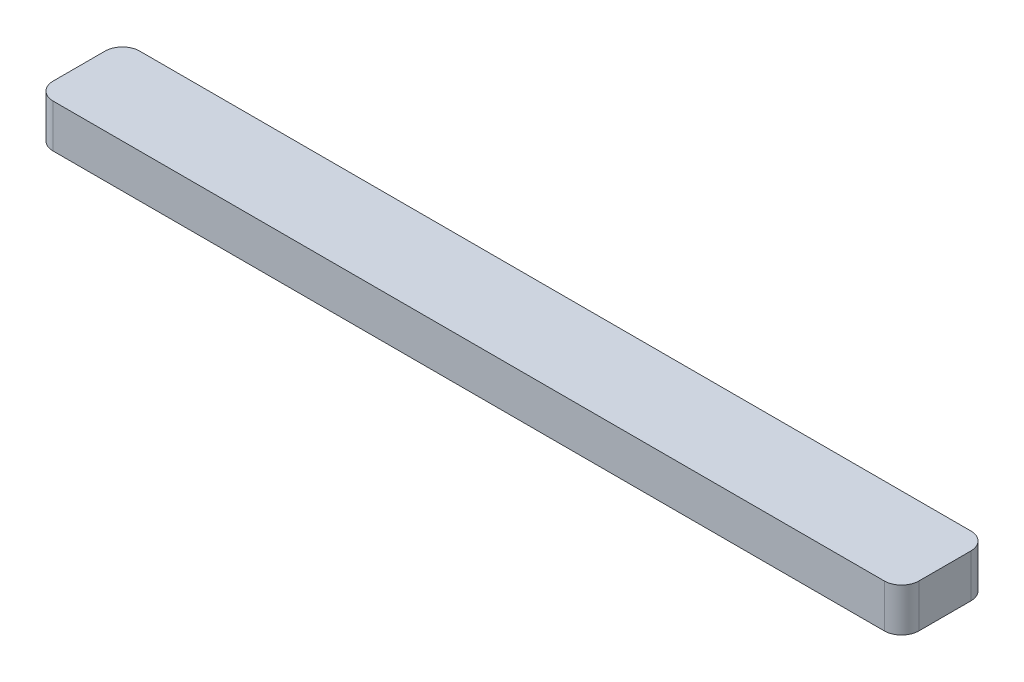
ISO-10303-21;
HEADER;
FILE_DESCRIPTION(('STEP AP214'),'2;1');
FILE_NAME('part.step','',(''),(''),'','','');
FILE_SCHEMA(('AUTOMOTIVE_DESIGN { 1 0 10303 214 1 1 1 1 }'));
ENDSEC;
DATA;
#1=APPLICATION_CONTEXT('core data for automotive mechanical design processes');
#2=APPLICATION_PROTOCOL_DEFINITION('international standard','automotive_design',2000,#1);
#3=PRODUCT_CONTEXT('',#1,'mechanical');
#4=PRODUCT('Part','Part','',(#3));
#5=PRODUCT_RELATED_PRODUCT_CATEGORY('part','',(#4));
#6=PRODUCT_DEFINITION_FORMATION('','',#4);
#7=PRODUCT_DEFINITION_CONTEXT('part definition',#1,'design');
#8=PRODUCT_DEFINITION('design','',#6,#7);
#9=PRODUCT_DEFINITION_SHAPE('','',#8);
#10=(LENGTH_UNIT() NAMED_UNIT(*) SI_UNIT(.MILLI.,.METRE.));
#11=(NAMED_UNIT(*) PLANE_ANGLE_UNIT() SI_UNIT($,.RADIAN.));
#12=(NAMED_UNIT(*) SI_UNIT($,.STERADIAN.) SOLID_ANGLE_UNIT());
#13=UNCERTAINTY_MEASURE_WITH_UNIT(LENGTH_MEASURE(1.E-05),#10,'distance_accuracy_value','');
#14=(GEOMETRIC_REPRESENTATION_CONTEXT(3) GLOBAL_UNCERTAINTY_ASSIGNED_CONTEXT((#13)) GLOBAL_UNIT_ASSIGNED_CONTEXT((#10,
#11,#12)) REPRESENTATION_CONTEXT('',''));
#15=CARTESIAN_POINT('',(0.,0.,0.));
#16=DIRECTION('',(0.,0.,1.));
#17=DIRECTION('',(1.,0.,0.));
#18=AXIS2_PLACEMENT_3D('',#15,#16,#17);
#19=CARTESIAN_POINT('',(48.,5.,-3.));
#20=DIRECTION('',(0.,-1.,0.));
#21=DIRECTION('',(0.,0.,-1.));
#22=AXIS2_PLACEMENT_3D('',#19,#20,#21);
#23=CYLINDRICAL_SURFACE('',#22,2.);
#24=CARTESIAN_POINT('',(48.,0.,-3.));
#25=DIRECTION('',(0.,1.,0.));
#26=DIRECTION('',(0.,0.,1.));
#27=AXIS2_PLACEMENT_3D('',#24,#25,#26);
#28=CIRCLE('',#27,2.);
#29=CARTESIAN_POINT('',(50.,0.,-3.));
#30=VERTEX_POINT('',#29);
#31=CARTESIAN_POINT('',(48.,0.,-5.));
#32=VERTEX_POINT('',#31);
#33=EDGE_CURVE('E129',#30,#32,#28,.T.);
#34=ORIENTED_EDGE('',*,*,#33,.T.);
#35=DIRECTION('',(0.,-1.,0.));
#36=VECTOR('',#35,1.);
#37=CARTESIAN_POINT('',(48.,5.,-5.));
#38=LINE('',#37,#36);
#39=CARTESIAN_POINT('',(48.,5.,-5.));
#40=VERTEX_POINT('',#39);
#41=EDGE_CURVE('E11',#40,#32,#38,.T.);
#42=ORIENTED_EDGE('',*,*,#41,.F.);
#43=CARTESIAN_POINT('',(48.,5.,-3.));
#44=DIRECTION('',(0.,1.,0.));
#45=DIRECTION('',(0.,0.,1.));
#46=AXIS2_PLACEMENT_3D('',#43,#44,#45);
#47=CIRCLE('',#46,2.);
#48=CARTESIAN_POINT('',(50.,5.,-3.));
#49=VERTEX_POINT('',#48);
#50=EDGE_CURVE('E143',#49,#40,#47,.T.);
#51=ORIENTED_EDGE('',*,*,#50,.F.);
#52=DIRECTION('',(0.,-1.,0.));
#53=VECTOR('',#52,1.);
#54=CARTESIAN_POINT('',(50.,5.,-3.));
#55=LINE('',#54,#53);
#56=EDGE_CURVE('E125',#49,#30,#55,.T.);
#57=ORIENTED_EDGE('',*,*,#56,.T.);
#58=EDGE_LOOP('',(#34,#42,#51,#57));
#59=FACE_BOUND('',#58,.T.);
#60=ADVANCED_FACE('F33',(#59),#23,.T.);
#61=CARTESIAN_POINT('',(-48.,5.,-5.));
#62=DIRECTION('',(0.,0.,1.));
#63=DIRECTION('',(1.,0.,0.));
#64=AXIS2_PLACEMENT_3D('',#61,#62,#63);
#65=PLANE('',#64);
#66=DIRECTION('',(-1.,0.,0.));
#67=VECTOR('',#66,1.);
#68=CARTESIAN_POINT('',(-48.,0.,-5.));
#69=LINE('',#68,#67);
#70=CARTESIAN_POINT('',(-48.,0.,-5.));
#71=VERTEX_POINT('',#70);
#72=EDGE_CURVE('E132',#32,#71,#69,.T.);
#73=ORIENTED_EDGE('',*,*,#72,.T.);
#74=DIRECTION('',(0.,-1.,0.));
#75=VECTOR('',#74,1.);
#76=CARTESIAN_POINT('',(-48.,5.,-5.));
#77=LINE('',#76,#75);
#78=CARTESIAN_POINT('',(-48.,5.,-5.));
#79=VERTEX_POINT('',#78);
#80=EDGE_CURVE('E41',#79,#71,#77,.T.);
#81=ORIENTED_EDGE('',*,*,#80,.F.);
#82=DIRECTION('',(-1.,0.,0.));
#83=VECTOR('',#82,1.);
#84=CARTESIAN_POINT('',(-48.,5.,-5.));
#85=LINE('',#84,#83);
#86=EDGE_CURVE('E92',#40,#79,#85,.T.);
#87=ORIENTED_EDGE('',*,*,#86,.F.);
#88=ORIENTED_EDGE('',*,*,#41,.T.);
#89=EDGE_LOOP('',(#73,#81,#87,#88));
#90=FACE_BOUND('',#89,.T.);
#91=ADVANCED_FACE('F178',(#90),#65,.F.);
#92=CARTESIAN_POINT('',(-48.,5.,-3.));
#93=DIRECTION('',(0.,-1.,0.));
#94=DIRECTION('',(0.,0.,-1.));
#95=AXIS2_PLACEMENT_3D('',#92,#93,#94);
#96=CYLINDRICAL_SURFACE('',#95,2.);
#97=CARTESIAN_POINT('',(-48.,0.,-3.));
#98=DIRECTION('',(0.,1.,0.));
#99=DIRECTION('',(0.,0.,-1.));
#100=AXIS2_PLACEMENT_3D('',#97,#98,#99);
#101=CIRCLE('',#100,2.);
#102=CARTESIAN_POINT('',(-50.,0.,-3.));
#103=VERTEX_POINT('',#102);
#104=EDGE_CURVE('E134',#71,#103,#101,.T.);
#105=ORIENTED_EDGE('',*,*,#104,.T.);
#106=DIRECTION('',(0.,-1.,0.));
#107=VECTOR('',#106,1.);
#108=CARTESIAN_POINT('',(-50.,5.,-3.));
#109=LINE('',#108,#107);
#110=CARTESIAN_POINT('',(-50.,5.,-3.));
#111=VERTEX_POINT('',#110);
#112=EDGE_CURVE('E150',#111,#103,#109,.T.);
#113=ORIENTED_EDGE('',*,*,#112,.F.);
#114=CARTESIAN_POINT('',(-48.,5.,-3.));
#115=DIRECTION('',(0.,1.,0.));
#116=DIRECTION('',(0.,0.,-1.));
#117=AXIS2_PLACEMENT_3D('',#114,#115,#116);
#118=CIRCLE('',#117,2.);
#119=EDGE_CURVE('E158',#79,#111,#118,.T.);
#120=ORIENTED_EDGE('',*,*,#119,.F.);
#121=ORIENTED_EDGE('',*,*,#80,.T.);
#122=EDGE_LOOP('',(#105,#113,#120,#121));
#123=FACE_BOUND('',#122,.T.);
#124=ADVANCED_FACE('F156',(#123),#96,.T.);
#125=CARTESIAN_POINT('',(-50.,5.,-3.));
#126=DIRECTION('',(1.,0.,0.));
#127=DIRECTION('',(0.,0.,-1.));
#128=AXIS2_PLACEMENT_3D('',#125,#126,#127);
#129=PLANE('',#128);
#130=DIRECTION('',(0.,0.,1.));
#131=VECTOR('',#130,1.);
#132=CARTESIAN_POINT('',(-50.,0.,-3.));
#133=LINE('',#132,#131);
#134=CARTESIAN_POINT('',(-50.,0.,3.));
#135=VERTEX_POINT('',#134);
#136=EDGE_CURVE('E136',#103,#135,#133,.T.);
#137=ORIENTED_EDGE('',*,*,#136,.T.);
#138=DIRECTION('',(0.,-1.,0.));
#139=VECTOR('',#138,1.);
#140=CARTESIAN_POINT('',(-50.,5.,3.));
#141=LINE('',#140,#139);
#142=CARTESIAN_POINT('',(-50.,5.,3.));
#143=VERTEX_POINT('',#142);
#144=EDGE_CURVE('E147',#143,#135,#141,.T.);
#145=ORIENTED_EDGE('',*,*,#144,.F.);
#146=DIRECTION('',(0.,0.,1.));
#147=VECTOR('',#146,1.);
#148=CARTESIAN_POINT('',(-50.,5.,-3.));
#149=LINE('',#148,#147);
#150=EDGE_CURVE('E170',#111,#143,#149,.T.);
#151=ORIENTED_EDGE('',*,*,#150,.F.);
#152=ORIENTED_EDGE('',*,*,#112,.T.);
#153=EDGE_LOOP('',(#137,#145,#151,#152));
#154=FACE_BOUND('',#153,.T.);
#155=ADVANCED_FACE('F166',(#154),#129,.F.);
#156=CARTESIAN_POINT('',(-48.,5.,3.));
#157=DIRECTION('',(0.,-1.,0.));
#158=DIRECTION('',(0.,0.,-1.));
#159=AXIS2_PLACEMENT_3D('',#156,#157,#158);
#160=CYLINDRICAL_SURFACE('',#159,2.);
#161=CARTESIAN_POINT('',(-48.,0.,3.));
#162=DIRECTION('',(0.,1.,0.));
#163=DIRECTION('',(0.,0.,-1.));
#164=AXIS2_PLACEMENT_3D('',#161,#162,#163);
#165=CIRCLE('',#164,2.);
#166=CARTESIAN_POINT('',(-48.,0.,5.));
#167=VERTEX_POINT('',#166);
#168=EDGE_CURVE('E138',#135,#167,#165,.T.);
#169=ORIENTED_EDGE('',*,*,#168,.T.);
#170=DIRECTION('',(0.,-1.,0.));
#171=VECTOR('',#170,1.);
#172=CARTESIAN_POINT('',(-48.,5.,5.));
#173=LINE('',#172,#171);
#174=CARTESIAN_POINT('',(-48.,5.,5.));
#175=VERTEX_POINT('',#174);
#176=EDGE_CURVE('E120',#175,#167,#173,.T.);
#177=ORIENTED_EDGE('',*,*,#176,.F.);
#178=CARTESIAN_POINT('',(-48.,5.,3.));
#179=DIRECTION('',(0.,1.,0.));
#180=DIRECTION('',(0.,0.,-1.));
#181=AXIS2_PLACEMENT_3D('',#178,#179,#180);
#182=CIRCLE('',#181,2.);
#183=EDGE_CURVE('E111',#143,#175,#182,.T.);
#184=ORIENTED_EDGE('',*,*,#183,.F.);
#185=ORIENTED_EDGE('',*,*,#144,.T.);
#186=EDGE_LOOP('',(#169,#177,#184,#185));
#187=FACE_BOUND('',#186,.T.);
#188=ADVANCED_FACE('F169',(#187),#160,.T.);
#189=CARTESIAN_POINT('',(-48.,5.,5.));
#190=DIRECTION('',(0.,0.,-1.));
#191=DIRECTION('',(-1.,0.,0.));
#192=AXIS2_PLACEMENT_3D('',#189,#190,#191);
#193=PLANE('',#192);
#194=DIRECTION('',(1.,0.,0.));
#195=VECTOR('',#194,1.);
#196=CARTESIAN_POINT('',(-48.,0.,5.));
#197=LINE('',#196,#195);
#198=CARTESIAN_POINT('',(48.,0.,5.));
#199=VERTEX_POINT('',#198);
#200=EDGE_CURVE('E119',#167,#199,#197,.T.);
#201=ORIENTED_EDGE('',*,*,#200,.T.);
#202=DIRECTION('',(0.,-1.,0.));
#203=VECTOR('',#202,1.);
#204=CARTESIAN_POINT('',(48.,5.,5.));
#205=LINE('',#204,#203);
#206=CARTESIAN_POINT('',(48.,5.,5.));
#207=VERTEX_POINT('',#206);
#208=EDGE_CURVE('E116',#207,#199,#205,.T.);
#209=ORIENTED_EDGE('',*,*,#208,.F.);
#210=DIRECTION('',(1.,0.,0.));
#211=VECTOR('',#210,1.);
#212=CARTESIAN_POINT('',(-48.,5.,5.));
#213=LINE('',#212,#211);
#214=EDGE_CURVE('E105',#175,#207,#213,.T.);
#215=ORIENTED_EDGE('',*,*,#214,.F.);
#216=ORIENTED_EDGE('',*,*,#176,.T.);
#217=EDGE_LOOP('',(#201,#209,#215,#216));
#218=FACE_BOUND('',#217,.T.);
#219=ADVANCED_FACE('F117',(#218),#193,.F.);
#220=CARTESIAN_POINT('',(48.,5.,3.));
#221=DIRECTION('',(0.,-1.,0.));
#222=DIRECTION('',(0.,0.,-1.));
#223=AXIS2_PLACEMENT_3D('',#220,#221,#222);
#224=CYLINDRICAL_SURFACE('',#223,2.);
#225=CARTESIAN_POINT('',(48.,0.,3.));
#226=DIRECTION('',(0.,1.,0.));
#227=DIRECTION('',(0.,0.,-1.));
#228=AXIS2_PLACEMENT_3D('',#225,#226,#227);
#229=CIRCLE('',#228,2.);
#230=CARTESIAN_POINT('',(50.,0.,3.));
#231=VERTEX_POINT('',#230);
#232=EDGE_CURVE('E78',#199,#231,#229,.T.);
#233=ORIENTED_EDGE('',*,*,#232,.T.);
#234=DIRECTION('',(0.,-1.,0.));
#235=VECTOR('',#234,1.);
#236=CARTESIAN_POINT('',(50.,5.,3.));
#237=LINE('',#236,#235);
#238=CARTESIAN_POINT('',(50.,5.,3.));
#239=VERTEX_POINT('',#238);
#240=EDGE_CURVE('E121',#239,#231,#237,.T.);
#241=ORIENTED_EDGE('',*,*,#240,.F.);
#242=CARTESIAN_POINT('',(48.,5.,3.));
#243=DIRECTION('',(0.,1.,0.));
#244=DIRECTION('',(0.,0.,-1.));
#245=AXIS2_PLACEMENT_3D('',#242,#243,#244);
#246=CIRCLE('',#245,2.);
#247=EDGE_CURVE('E109',#207,#239,#246,.T.);
#248=ORIENTED_EDGE('',*,*,#247,.F.);
#249=ORIENTED_EDGE('',*,*,#208,.T.);
#250=EDGE_LOOP('',(#233,#241,#248,#249));
#251=FACE_BOUND('',#250,.T.);
#252=ADVANCED_FACE('F123',(#251),#224,.T.);
#253=CARTESIAN_POINT('',(50.,5.,-3.));
#254=DIRECTION('',(-1.,0.,0.));
#255=DIRECTION('',(0.,0.,1.));
#256=AXIS2_PLACEMENT_3D('',#253,#254,#255);
#257=PLANE('',#256);
#258=DIRECTION('',(0.,0.,-1.));
#259=VECTOR('',#258,1.);
#260=CARTESIAN_POINT('',(50.,0.,-3.));
#261=LINE('',#260,#259);
#262=EDGE_CURVE('E84',#231,#30,#261,.T.);
#263=ORIENTED_EDGE('',*,*,#262,.T.);
#264=ORIENTED_EDGE('',*,*,#56,.F.);
#265=DIRECTION('',(0.,0.,-1.));
#266=VECTOR('',#265,1.);
#267=CARTESIAN_POINT('',(50.,5.,-3.));
#268=LINE('',#267,#266);
#269=EDGE_CURVE('E49',#239,#49,#268,.T.);
#270=ORIENTED_EDGE('',*,*,#269,.F.);
#271=ORIENTED_EDGE('',*,*,#240,.T.);
#272=EDGE_LOOP('',(#263,#264,#270,#271));
#273=FACE_BOUND('',#272,.T.);
#274=ADVANCED_FACE('F194',(#273),#257,.F.);
#275=CARTESIAN_POINT('',(48.,5.,-3.));
#276=DIRECTION('',(0.,1.,0.));
#277=DIRECTION('',(0.,0.,1.));
#278=AXIS2_PLACEMENT_3D('',#275,#276,#277);
#279=PLANE('',#278);
#280=ORIENTED_EDGE('',*,*,#50,.T.);
#281=ORIENTED_EDGE('',*,*,#86,.T.);
#282=ORIENTED_EDGE('',*,*,#119,.T.);
#283=ORIENTED_EDGE('',*,*,#150,.T.);
#284=ORIENTED_EDGE('',*,*,#183,.T.);
#285=ORIENTED_EDGE('',*,*,#214,.T.);
#286=ORIENTED_EDGE('',*,*,#247,.T.);
#287=ORIENTED_EDGE('',*,*,#269,.T.);
#288=EDGE_LOOP('',(#280,#281,#282,#283,#284,#285,#286,#287));
#289=FACE_BOUND('',#288,.T.);
#290=ADVANCED_FACE('F107',(#289),#279,.T.);
#291=CARTESIAN_POINT('',(48.,0.,-3.));
#292=DIRECTION('',(0.,1.,0.));
#293=DIRECTION('',(0.,0.,1.));
#294=AXIS2_PLACEMENT_3D('',#291,#292,#293);
#295=PLANE('',#294);
#296=ORIENTED_EDGE('',*,*,#33,.F.);
#297=ORIENTED_EDGE('',*,*,#262,.F.);
#298=ORIENTED_EDGE('',*,*,#232,.F.);
#299=ORIENTED_EDGE('',*,*,#200,.F.);
#300=ORIENTED_EDGE('',*,*,#168,.F.);
#301=ORIENTED_EDGE('',*,*,#136,.F.);
#302=ORIENTED_EDGE('',*,*,#104,.F.);
#303=ORIENTED_EDGE('',*,*,#72,.F.);
#304=EDGE_LOOP('',(#296,#297,#298,#299,#300,#301,#302,#303));
#305=FACE_BOUND('',#304,.T.);
#306=ADVANCED_FACE('F162',(#305),#295,.F.);
#307=CLOSED_SHELL('',(#60,#91,#124,#155,#188,#219,#252,#274,#290,#306));
#308=MANIFOLD_SOLID_BREP('B2',#307);
#309=ADVANCED_BREP_SHAPE_REPRESENTATION('',(#18,#308),#14);
#310=SHAPE_DEFINITION_REPRESENTATION(#9,#309);
ENDSEC;
END-ISO-10303-21;
